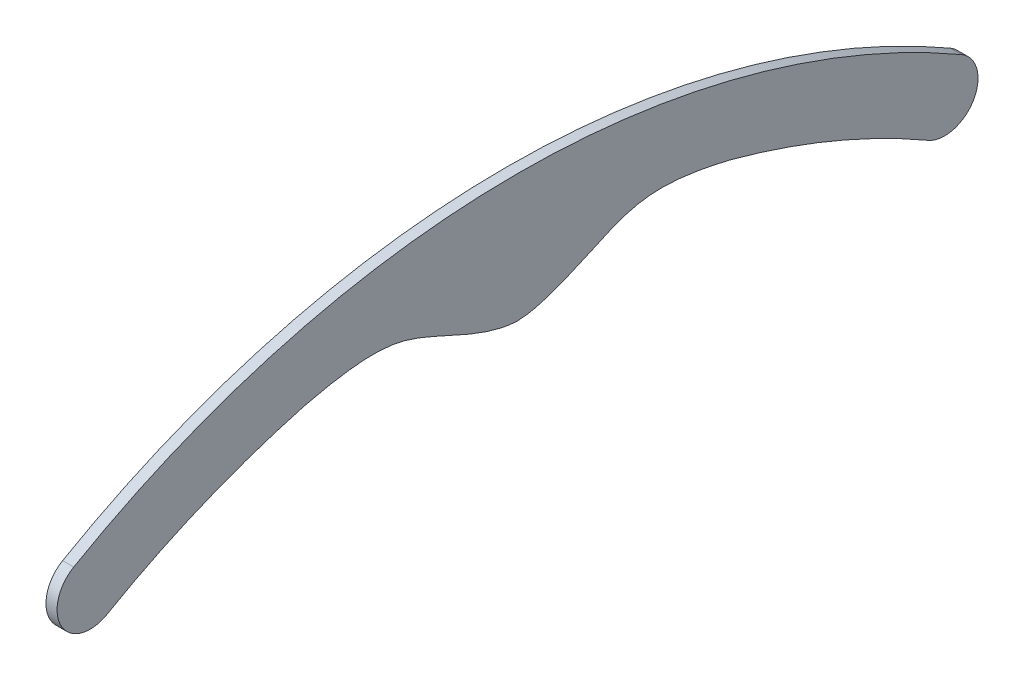
ISO-10303-21;
HEADER;
FILE_DESCRIPTION(('STEP AP214'),'2;1');
FILE_NAME('part.step','',(''),(''),'','','');
FILE_SCHEMA(('AUTOMOTIVE_DESIGN { 1 0 10303 214 1 1 1 1 }'));
ENDSEC;
DATA;
#1=APPLICATION_CONTEXT('core data for automotive mechanical design processes');
#2=APPLICATION_PROTOCOL_DEFINITION('international standard','automotive_design',2000,#1);
#3=PRODUCT_CONTEXT('',#1,'mechanical');
#4=PRODUCT('Part','Part','',(#3));
#5=PRODUCT_RELATED_PRODUCT_CATEGORY('part','',(#4));
#6=PRODUCT_DEFINITION_FORMATION('','',#4);
#7=PRODUCT_DEFINITION_CONTEXT('part definition',#1,'design');
#8=PRODUCT_DEFINITION('design','',#6,#7);
#9=PRODUCT_DEFINITION_SHAPE('','',#8);
#10=(LENGTH_UNIT() NAMED_UNIT(*) SI_UNIT(.MILLI.,.METRE.));
#11=(NAMED_UNIT(*) PLANE_ANGLE_UNIT() SI_UNIT($,.RADIAN.));
#12=(NAMED_UNIT(*) SI_UNIT($,.STERADIAN.) SOLID_ANGLE_UNIT());
#13=UNCERTAINTY_MEASURE_WITH_UNIT(LENGTH_MEASURE(1.E-05),#10,'distance_accuracy_value','');
#14=(GEOMETRIC_REPRESENTATION_CONTEXT(3) GLOBAL_UNCERTAINTY_ASSIGNED_CONTEXT((#13)) GLOBAL_UNIT_ASSIGNED_CONTEXT((#10,
#11,#12)) REPRESENTATION_CONTEXT('',''));
#15=CARTESIAN_POINT('',(0.,0.,0.));
#16=DIRECTION('',(0.,0.,1.));
#17=DIRECTION('',(1.,0.,0.));
#18=AXIS2_PLACEMENT_3D('',#15,#16,#17);
#19=CARTESIAN_POINT('',(2.5,344.260761827477,-96.2499999999981));
#20=DIRECTION('',(-1.,0.,0.));
#21=DIRECTION('',(0.,0.,1.));
#22=AXIS2_PLACEMENT_3D('',#19,#20,#21);
#23=CYLINDRICAL_SURFACE('',#22,7.50000000000001);
#24=CARTESIAN_POINT('',(0.,344.260761827477,-96.2499999999981));
#25=DIRECTION('',(1.,0.,0.));
#26=DIRECTION('',(0.,0.,1.));
#27=AXIS2_PLACEMENT_3D('',#24,#25,#26);
#28=CIRCLE('',#27,7.50000000000001);
#29=CARTESIAN_POINT('',(0.,337.765571299093,-92.4999999999982));
#30=VERTEX_POINT('',#29);
#31=CARTESIAN_POINT('',(0.,350.755952355859,-100.));
#32=VERTEX_POINT('',#31);
#33=EDGE_CURVE('E167',#30,#32,#28,.T.);
#34=ORIENTED_EDGE('',*,*,#33,.T.);
#35=DIRECTION('',(-1.,0.,0.));
#36=VECTOR('',#35,1.);
#37=CARTESIAN_POINT('',(2.5,350.755952355859,-100.));
#38=LINE('',#37,#36);
#39=CARTESIAN_POINT('',(2.5,350.755952355859,-100.));
#40=VERTEX_POINT('',#39);
#41=EDGE_CURVE('E11',#40,#32,#38,.T.);
#42=ORIENTED_EDGE('',*,*,#41,.F.);
#43=CARTESIAN_POINT('',(2.5,344.260761827477,-96.2499999999981));
#44=DIRECTION('',(1.,0.,0.));
#45=DIRECTION('',(0.,0.,1.));
#46=AXIS2_PLACEMENT_3D('',#43,#44,#45);
#47=CIRCLE('',#46,7.50000000000001);
#48=CARTESIAN_POINT('',(2.5,337.765571299093,-92.4999999999982));
#49=VERTEX_POINT('',#48);
#50=EDGE_CURVE('E191',#49,#40,#47,.T.);
#51=ORIENTED_EDGE('',*,*,#50,.F.);
#52=DIRECTION('',(-1.,0.,0.));
#53=VECTOR('',#52,1.);
#54=CARTESIAN_POINT('',(2.5,337.765571299093,-92.4999999999982));
#55=LINE('',#54,#53);
#56=EDGE_CURVE('E123',#49,#30,#55,.T.);
#57=ORIENTED_EDGE('',*,*,#56,.T.);
#58=EDGE_LOOP('',(#34,#42,#51,#57));
#59=FACE_BOUND('',#58,.T.);
#60=ADVANCED_FACE('F40',(#59),#23,.T.);
#61=CARTESIAN_POINT('',(2.5,177.550871598971,0.));
#62=DIRECTION('',(-1.,0.,0.));
#63=DIRECTION('',(0.,0.,1.));
#64=AXIS2_PLACEMENT_3D('',#61,#62,#63);
#65=CYLINDRICAL_SURFACE('',#64,200.);
#66=CARTESIAN_POINT('',(0.,177.550871598971,0.));
#67=DIRECTION('',(1.,0.,0.));
#68=DIRECTION('',(0.,0.,-1.));
#69=AXIS2_PLACEMENT_3D('',#66,#67,#68);
#70=CIRCLE('',#69,200.);
#71=CARTESIAN_POINT('',(0.,350.755952355859,100.));
#72=VERTEX_POINT('',#71);
#73=EDGE_CURVE('E160',#32,#72,#70,.T.);
#74=ORIENTED_EDGE('',*,*,#73,.T.);
#75=DIRECTION('',(-1.,0.,0.));
#76=VECTOR('',#75,1.);
#77=CARTESIAN_POINT('',(2.5,350.755952355859,100.));
#78=LINE('',#77,#76);
#79=CARTESIAN_POINT('',(2.5,350.755952355859,100.));
#80=VERTEX_POINT('',#79);
#81=EDGE_CURVE('E44',#80,#72,#78,.T.);
#82=ORIENTED_EDGE('',*,*,#81,.F.);
#83=CARTESIAN_POINT('',(2.5,177.550871598971,0.));
#84=DIRECTION('',(1.,0.,0.));
#85=DIRECTION('',(0.,0.,-1.));
#86=AXIS2_PLACEMENT_3D('',#83,#84,#85);
#87=CIRCLE('',#86,200.);
#88=EDGE_CURVE('E91',#40,#80,#87,.T.);
#89=ORIENTED_EDGE('',*,*,#88,.F.);
#90=ORIENTED_EDGE('',*,*,#41,.T.);
#91=EDGE_LOOP('',(#74,#82,#89,#90));
#92=FACE_BOUND('',#91,.T.);
#93=ADVANCED_FACE('F147',(#92),#65,.T.);
#94=CARTESIAN_POINT('',(2.5,344.260761827477,96.2499999999982));
#95=DIRECTION('',(-1.,0.,0.));
#96=DIRECTION('',(0.,0.,1.));
#97=AXIS2_PLACEMENT_3D('',#94,#95,#96);
#98=CYLINDRICAL_SURFACE('',#97,7.50000000000001);
#99=CARTESIAN_POINT('',(0.,344.260761827477,96.2499999999982));
#100=DIRECTION('',(1.,0.,0.));
#101=DIRECTION('',(0.,0.,1.));
#102=AXIS2_PLACEMENT_3D('',#99,#100,#101);
#103=CIRCLE('',#102,7.50000000000001);
#104=CARTESIAN_POINT('',(0.,337.765571299093,92.4999999999982));
#105=VERTEX_POINT('',#104);
#106=EDGE_CURVE('E164',#72,#105,#103,.T.);
#107=ORIENTED_EDGE('',*,*,#106,.T.);
#108=DIRECTION('',(-1.,0.,0.));
#109=VECTOR('',#108,1.);
#110=CARTESIAN_POINT('',(2.5,337.765571299093,92.4999999999982));
#111=LINE('',#110,#109);
#112=CARTESIAN_POINT('',(2.5,337.765571299093,92.4999999999982));
#113=VERTEX_POINT('',#112);
#114=EDGE_CURVE('E173',#113,#105,#111,.T.);
#115=ORIENTED_EDGE('',*,*,#114,.F.);
#116=CARTESIAN_POINT('',(2.5,344.260761827477,96.2499999999982));
#117=DIRECTION('',(1.,0.,0.));
#118=DIRECTION('',(0.,0.,1.));
#119=AXIS2_PLACEMENT_3D('',#116,#117,#118);
#120=CIRCLE('',#119,7.50000000000001);
#121=EDGE_CURVE('E168',#80,#113,#120,.T.);
#122=ORIENTED_EDGE('',*,*,#121,.F.);
#123=ORIENTED_EDGE('',*,*,#81,.T.);
#124=EDGE_LOOP('',(#107,#115,#122,#123));
#125=FACE_BOUND('',#124,.T.);
#126=ADVANCED_FACE('F150',(#125),#98,.T.);
#127=CARTESIAN_POINT('',(2.5,177.550871598971,0.));
#128=DIRECTION('',(-1.,0.,0.));
#129=DIRECTION('',(0.,0.,1.));
#130=AXIS2_PLACEMENT_3D('',#127,#128,#129);
#131=CYLINDRICAL_SURFACE('',#130,185.);
#132=CARTESIAN_POINT('',(0.,177.550871598971,0.));
#133=DIRECTION('',(-1.,0.,0.));
#134=DIRECTION('',(0.,0.,-1.));
#135=AXIS2_PLACEMENT_3D('',#132,#133,#134);
#136=CIRCLE('',#135,185.);
#137=CARTESIAN_POINT('',(0.,356.238644162174,47.9132542873184));
#138=VERTEX_POINT('',#137);
#139=EDGE_CURVE('E175',#105,#138,#136,.T.);
#140=ORIENTED_EDGE('',*,*,#139,.T.);
#141=DIRECTION('',(-1.,0.,0.));
#142=VECTOR('',#141,1.);
#143=CARTESIAN_POINT('',(2.5,356.238644162174,47.9132542873184));
#144=LINE('',#143,#142);
#145=CARTESIAN_POINT('',(2.5,356.238644162174,47.9132542873184));
#146=VERTEX_POINT('',#145);
#147=EDGE_CURVE('E117',#146,#138,#144,.T.);
#148=ORIENTED_EDGE('',*,*,#147,.F.);
#149=CARTESIAN_POINT('',(2.5,177.550871598971,0.));
#150=DIRECTION('',(-1.,0.,0.));
#151=DIRECTION('',(0.,0.,-1.));
#152=AXIS2_PLACEMENT_3D('',#149,#150,#151);
#153=CIRCLE('',#152,185.);
#154=EDGE_CURVE('E108',#113,#146,#153,.T.);
#155=ORIENTED_EDGE('',*,*,#154,.F.);
#156=ORIENTED_EDGE('',*,*,#114,.T.);
#157=EDGE_LOOP('',(#140,#148,#155,#156));
#158=FACE_BOUND('',#157,.T.);
#159=ADVANCED_FACE('F145',(#158),#131,.F.);
#160=CARTESIAN_POINT('',(2.5,356.238644162174,47.9132542873184));
#161=CARTESIAN_POINT('',(2.5,360.346037990184,30.9054782656777));
#162=CARTESIAN_POINT('',(2.5,357.108936785638,22.6327434779222));
#163=CARTESIAN_POINT('',(2.5,348.864388440989,5.27893283563052));
#164=CARTESIAN_POINT('',(2.5,348.785718872287,0.));
#165=B_SPLINE_CURVE_WITH_KNOTS('',3,(#160,#161,#162,#163,#164),.UNSPECIFIED.,.F.,.F.,(4,1,4),
(0.0972429385282775,0.64667802498621,1.),.UNSPECIFIED.);
#166=DIRECTION('',(-1.,0.,0.));
#167=VECTOR('',#166,1.);
#168=SURFACE_OF_LINEAR_EXTRUSION('',#165,#167);
#169=CARTESIAN_POINT('',(0.,356.238644162174,47.9132542873184));
#170=CARTESIAN_POINT('',(0.,360.346037990184,30.9054782656777));
#171=CARTESIAN_POINT('',(0.,357.108936785638,22.6327434779222));
#172=CARTESIAN_POINT('',(0.,348.864388440989,5.27893283563052));
#173=CARTESIAN_POINT('',(0.,348.785718872287,0.));
#174=B_SPLINE_CURVE_WITH_KNOTS('',3,(#169,#170,#171,#172,#173),.UNSPECIFIED.,.F.,.F.,(4,1,4),
(0.0972429385282775,0.64667802498621,1.),.UNSPECIFIED.);
#175=CARTESIAN_POINT('',(0.,348.785718872287,0.));
#176=VERTEX_POINT('',#175);
#177=EDGE_CURVE('E119',#138,#176,#174,.T.);
#178=ORIENTED_EDGE('',*,*,#177,.T.);
#179=DIRECTION('',(-1.,0.,0.));
#180=VECTOR('',#179,1.);
#181=CARTESIAN_POINT('',(2.5,348.785718872287,0.));
#182=LINE('',#181,#180);
#183=CARTESIAN_POINT('',(2.5,348.785718872287,0.));
#184=VERTEX_POINT('',#183);
#185=EDGE_CURVE('E111',#184,#176,#182,.T.);
#186=ORIENTED_EDGE('',*,*,#185,.F.);
#187=EDGE_CURVE('E103',#146,#184,#165,.T.);
#188=ORIENTED_EDGE('',*,*,#187,.F.);
#189=ORIENTED_EDGE('',*,*,#147,.T.);
#190=EDGE_LOOP('',(#178,#186,#188,#189));
#191=FACE_BOUND('',#190,.T.);
#192=ADVANCED_FACE('F113',(#191),#168,.F.);
#193=CARTESIAN_POINT('',(2.5,348.785718872287,0.));
#194=CARTESIAN_POINT('',(2.5,348.864388440989,-5.27893283563052));
#195=CARTESIAN_POINT('',(2.5,357.108936785638,-22.6327434779222));
#196=CARTESIAN_POINT('',(2.5,360.346037990184,-30.9054782656777));
#197=CARTESIAN_POINT('',(2.5,356.238644162174,-47.9132542873184));
#198=B_SPLINE_CURVE_WITH_KNOTS('',3,(#193,#194,#195,#196,#197),.UNSPECIFIED.,.F.,.F.,(4,1,4),
(0.0972429385282775,0.450564913542067,1.),.UNSPECIFIED.);
#199=DIRECTION('',(-1.,0.,0.));
#200=VECTOR('',#199,1.);
#201=SURFACE_OF_LINEAR_EXTRUSION('',#198,#200);
#202=CARTESIAN_POINT('',(0.,348.785718872287,0.));
#203=CARTESIAN_POINT('',(0.,348.864388440989,-5.27893283563052));
#204=CARTESIAN_POINT('',(0.,357.108936785638,-22.6327434779222));
#205=CARTESIAN_POINT('',(0.,360.346037990184,-30.9054782656777));
#206=CARTESIAN_POINT('',(0.,356.238644162174,-47.9132542873184));
#207=B_SPLINE_CURVE_WITH_KNOTS('',3,(#202,#203,#204,#205,#206),.UNSPECIFIED.,.F.,.F.,(4,1,4),
(0.0972429385282775,0.450564913542067,1.),.UNSPECIFIED.);
#208=CARTESIAN_POINT('',(0.,356.238644162174,-47.9132542873185));
#209=VERTEX_POINT('',#208);
#210=EDGE_CURVE('E80',#176,#209,#207,.T.);
#211=ORIENTED_EDGE('',*,*,#210,.T.);
#212=DIRECTION('',(-1.,0.,0.));
#213=VECTOR('',#212,1.);
#214=CARTESIAN_POINT('',(2.5,356.238644162174,-47.9132542873185));
#215=LINE('',#214,#213);
#216=CARTESIAN_POINT('',(2.5,356.238644162174,-47.9132542873185));
#217=VERTEX_POINT('',#216);
#218=EDGE_CURVE('E120',#217,#209,#215,.T.);
#219=ORIENTED_EDGE('',*,*,#218,.F.);
#220=EDGE_CURVE('E110',#184,#217,#198,.T.);
#221=ORIENTED_EDGE('',*,*,#220,.F.);
#222=ORIENTED_EDGE('',*,*,#185,.T.);
#223=EDGE_LOOP('',(#211,#219,#221,#222));
#224=FACE_BOUND('',#223,.T.);
#225=ADVANCED_FACE('F121',(#224),#201,.F.);
#226=CARTESIAN_POINT('',(2.5,177.550871598971,0.));
#227=DIRECTION('',(-1.,0.,0.));
#228=DIRECTION('',(0.,0.,1.));
#229=AXIS2_PLACEMENT_3D('',#226,#227,#228);
#230=CYLINDRICAL_SURFACE('',#229,185.);
#231=CARTESIAN_POINT('',(0.,177.550871598971,0.));
#232=DIRECTION('',(-1.,0.,0.));
#233=DIRECTION('',(0.,0.,-1.));
#234=AXIS2_PLACEMENT_3D('',#231,#232,#233);
#235=CIRCLE('',#234,185.);
#236=EDGE_CURVE('E84',#209,#30,#235,.T.);
#237=ORIENTED_EDGE('',*,*,#236,.T.);
#238=ORIENTED_EDGE('',*,*,#56,.F.);
#239=CARTESIAN_POINT('',(2.5,177.550871598971,0.));
#240=DIRECTION('',(-1.,0.,0.));
#241=DIRECTION('',(0.,0.,-1.));
#242=AXIS2_PLACEMENT_3D('',#239,#240,#241);
#243=CIRCLE('',#242,185.);
#244=EDGE_CURVE('E52',#217,#49,#243,.T.);
#245=ORIENTED_EDGE('',*,*,#244,.F.);
#246=ORIENTED_EDGE('',*,*,#218,.T.);
#247=EDGE_LOOP('',(#237,#238,#245,#246));
#248=FACE_BOUND('',#247,.T.);
#249=ADVANCED_FACE('F139',(#248),#230,.F.);
#250=CARTESIAN_POINT('',(2.5,344.260761827477,-96.2499999999981));
#251=DIRECTION('',(-1.,0.,0.));
#252=DIRECTION('',(0.,0.,1.));
#253=AXIS2_PLACEMENT_3D('',#250,#251,#252);
#254=PLANE('',#253);
#255=ORIENTED_EDGE('',*,*,#50,.T.);
#256=ORIENTED_EDGE('',*,*,#88,.T.);
#257=ORIENTED_EDGE('',*,*,#121,.T.);
#258=ORIENTED_EDGE('',*,*,#154,.T.);
#259=ORIENTED_EDGE('',*,*,#187,.T.);
#260=ORIENTED_EDGE('',*,*,#220,.T.);
#261=ORIENTED_EDGE('',*,*,#244,.T.);
#262=EDGE_LOOP('',(#255,#256,#257,#258,#259,#260,#261));
#263=FACE_BOUND('',#262,.T.);
#264=ADVANCED_FACE('F104',(#263),#254,.F.);
#265=CARTESIAN_POINT('',(0.,344.260761827477,-96.2499999999981));
#266=DIRECTION('',(-1.,0.,0.));
#267=DIRECTION('',(0.,0.,1.));
#268=AXIS2_PLACEMENT_3D('',#265,#266,#267);
#269=PLANE('',#268);
#270=ORIENTED_EDGE('',*,*,#33,.F.);
#271=ORIENTED_EDGE('',*,*,#236,.F.);
#272=ORIENTED_EDGE('',*,*,#210,.F.);
#273=ORIENTED_EDGE('',*,*,#177,.F.);
#274=ORIENTED_EDGE('',*,*,#139,.F.);
#275=ORIENTED_EDGE('',*,*,#106,.F.);
#276=ORIENTED_EDGE('',*,*,#73,.F.);
#277=EDGE_LOOP('',(#270,#271,#272,#273,#274,#275,#276));
#278=FACE_BOUND('',#277,.T.);
#279=ADVANCED_FACE('F172',(#278),#269,.T.);
#280=CLOSED_SHELL('',(#60,#93,#126,#159,#192,#225,#249,#264,#279));
#281=MANIFOLD_SOLID_BREP('B2',#280);
#282=ADVANCED_BREP_SHAPE_REPRESENTATION('',(#18,#281),#14);
#283=SHAPE_DEFINITION_REPRESENTATION(#9,#282);
ENDSEC;
END-ISO-10303-21;
